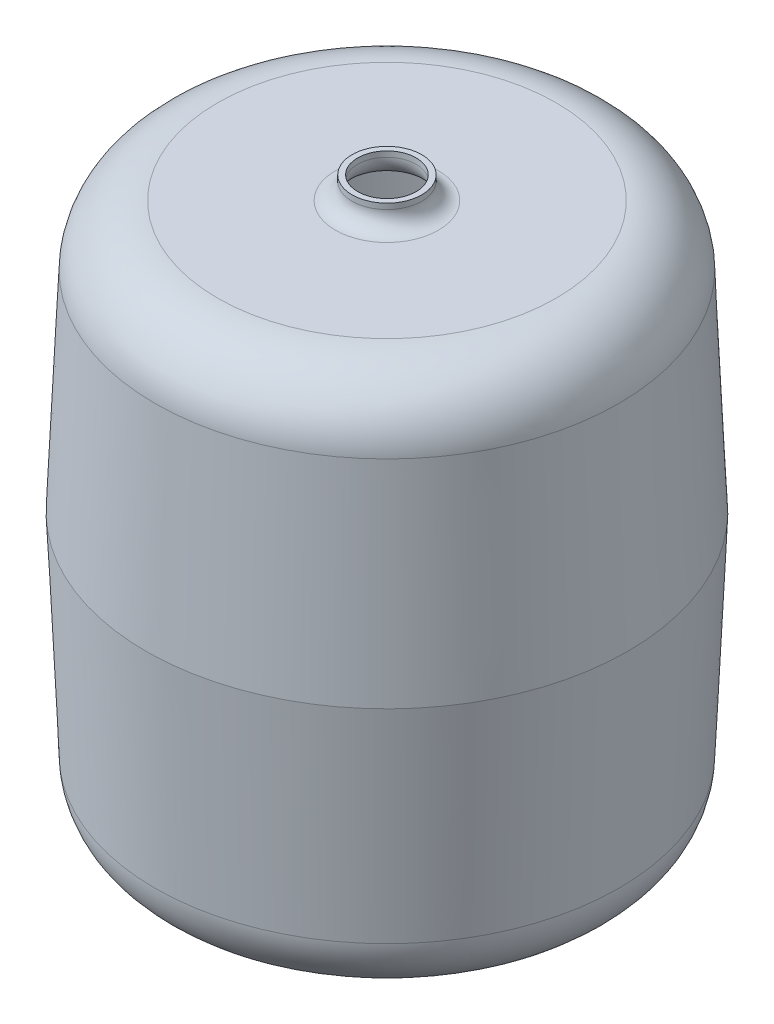
ISO-10303-21;
HEADER;
FILE_DESCRIPTION(('STEP AP214'),'2;1');
FILE_NAME('part.step','',(''),(''),'','','');
FILE_SCHEMA(('AUTOMOTIVE_DESIGN { 1 0 10303 214 1 1 1 1 }'));
ENDSEC;
DATA;
#1=APPLICATION_CONTEXT('core data for automotive mechanical design processes');
#2=APPLICATION_PROTOCOL_DEFINITION('international standard','automotive_design',2000,#1);
#3=PRODUCT_CONTEXT('',#1,'mechanical');
#4=PRODUCT('Part','Part','',(#3));
#5=PRODUCT_RELATED_PRODUCT_CATEGORY('part','',(#4));
#6=PRODUCT_DEFINITION_FORMATION('','',#4);
#7=PRODUCT_DEFINITION_CONTEXT('part definition',#1,'design');
#8=PRODUCT_DEFINITION('design','',#6,#7);
#9=PRODUCT_DEFINITION_SHAPE('','',#8);
#10=(LENGTH_UNIT() NAMED_UNIT(*) SI_UNIT(.MILLI.,.METRE.));
#11=(NAMED_UNIT(*) PLANE_ANGLE_UNIT() SI_UNIT($,.RADIAN.));
#12=(NAMED_UNIT(*) SI_UNIT($,.STERADIAN.) SOLID_ANGLE_UNIT());
#13=UNCERTAINTY_MEASURE_WITH_UNIT(LENGTH_MEASURE(1.E-05),#10,'distance_accuracy_value','');
#14=(GEOMETRIC_REPRESENTATION_CONTEXT(3) GLOBAL_UNCERTAINTY_ASSIGNED_CONTEXT((#13)) GLOBAL_UNIT_ASSIGNED_CONTEXT((#10,
#11,#12)) REPRESENTATION_CONTEXT('',''));
#15=CARTESIAN_POINT('',(0.,0.,0.));
#16=DIRECTION('',(0.,0.,1.));
#17=DIRECTION('',(1.,0.,0.));
#18=AXIS2_PLACEMENT_3D('',#15,#16,#17);
#19=CARTESIAN_POINT('',(0.,-193.75,0.));
#20=DIRECTION('',(0.,-1.,0.));
#21=DIRECTION('',(1.,0.,0.));
#22=AXIS2_PLACEMENT_3D('',#19,#20,#21);
#23=PLANE('',#22);
#24=CARTESIAN_POINT('',(0.,-193.75,0.));
#25=DIRECTION('',(0.,-1.,0.));
#26=DIRECTION('',(1.,0.,0.));
#27=AXIS2_PLACEMENT_3D('',#24,#25,#26);
#28=CIRCLE('',#27,121.539022915144);
#29=CARTESIAN_POINT('',(121.539022915144,-193.75,0.));
#30=VERTEX_POINT('',#29);
#31=EDGE_CURVE('E10',#30,#30,#28,.T.);
#32=ORIENTED_EDGE('',*,*,#31,.T.);
#33=EDGE_LOOP('',(#32));
#34=FACE_BOUND('',#33,.T.);
#35=ADVANCED_FACE('F34',(#34),#23,.T.);
#36=CARTESIAN_POINT('',(0.,-148.75,0.));
#37=DIRECTION('',(0.,-1.,0.));
#38=DIRECTION('',(1.,0.,0.));
#39=AXIS2_PLACEMENT_3D('',#36,#37,#38);
#40=TOROIDAL_SURFACE('',#39,121.539022915144,45.);
#41=CARTESIAN_POINT('',(0.,-150.71287243144,0.));
#42=DIRECTION('',(0.,-1.,0.));
#43=DIRECTION('',(1.,0.,0.));
#44=AXIS2_PLACEMENT_3D('',#41,#42,#43);
#45=CIRCLE('',#44,166.496192886328);
#46=CARTESIAN_POINT('',(166.496192886328,-150.71287243144,0.));
#47=VERTEX_POINT('',#46);
#48=EDGE_CURVE('E40',#47,#47,#45,.T.);
#49=ORIENTED_EDGE('',*,*,#48,.T.);
#50=EDGE_LOOP('',(#49));
#51=FACE_BOUND('',#50,.T.);
#52=ORIENTED_EDGE('',*,*,#31,.F.);
#53=EDGE_LOOP('',(#52));
#54=FACE_BOUND('',#53,.T.);
#55=ADVANCED_FACE('F102',(#51,#54),#40,.T.);
#56=CARTESIAN_POINT('',(0.,-150.71287243144,0.));
#57=DIRECTION('',(0.,1.,0.));
#58=DIRECTION('',(-1.,0.,0.));
#59=AXIS2_PLACEMENT_3D('',#56,#57,#58);
#60=CONICAL_SURFACE('',#59,166.496192886328,0.0436332312998528);
#61=CARTESIAN_POINT('',(0.,0.,0.));
#62=DIRECTION('',(0.,-1.,0.));
#63=DIRECTION('',(1.,0.,0.));
#64=AXIS2_PLACEMENT_3D('',#61,#62,#63);
#65=CIRCLE('',#64,173.076459005134);
#66=CARTESIAN_POINT('',(173.076459005134,0.,0.));
#67=VERTEX_POINT('',#66);
#68=EDGE_CURVE('E44',#67,#67,#65,.T.);
#69=ORIENTED_EDGE('',*,*,#68,.T.);
#70=EDGE_LOOP('',(#69));
#71=FACE_BOUND('',#70,.T.);
#72=ORIENTED_EDGE('',*,*,#48,.F.);
#73=EDGE_LOOP('',(#72));
#74=FACE_BOUND('',#73,.T.);
#75=ADVANCED_FACE('F106',(#71,#74),#60,.T.);
#76=CARTESIAN_POINT('',(0.,0.,0.));
#77=DIRECTION('',(0.,-1.,0.));
#78=DIRECTION('',(1.,0.,0.));
#79=AXIS2_PLACEMENT_3D('',#76,#77,#78);
#80=CONICAL_SURFACE('',#79,173.076459005134,0.0436332312998534);
#81=CARTESIAN_POINT('',(0.,150.71287243144,0.));
#82=DIRECTION('',(0.,-1.,0.));
#83=DIRECTION('',(1.,0.,0.));
#84=AXIS2_PLACEMENT_3D('',#81,#82,#83);
#85=CIRCLE('',#84,166.496192886327);
#86=CARTESIAN_POINT('',(166.496192886327,150.71287243144,0.));
#87=VERTEX_POINT('',#86);
#88=EDGE_CURVE('E48',#87,#87,#85,.T.);
#89=ORIENTED_EDGE('',*,*,#88,.T.);
#90=EDGE_LOOP('',(#89));
#91=FACE_BOUND('',#90,.T.);
#92=ORIENTED_EDGE('',*,*,#68,.F.);
#93=EDGE_LOOP('',(#92));
#94=FACE_BOUND('',#93,.T.);
#95=ADVANCED_FACE('F110',(#91,#94),#80,.T.);
#96=CARTESIAN_POINT('',(0.,148.75,0.));
#97=DIRECTION('',(0.,-1.,0.));
#98=DIRECTION('',(1.,0.,0.));
#99=AXIS2_PLACEMENT_3D('',#96,#97,#98);
#100=TOROIDAL_SURFACE('',#99,121.539022915144,45.0000000000002);
#101=CARTESIAN_POINT('',(0.,193.75,0.));
#102=DIRECTION('',(0.,-1.,0.));
#103=DIRECTION('',(1.,0.,0.));
#104=AXIS2_PLACEMENT_3D('',#101,#102,#103);
#105=CIRCLE('',#104,121.539022915144);
#106=CARTESIAN_POINT('',(121.539022915144,193.75,0.));
#107=VERTEX_POINT('',#106);
#108=EDGE_CURVE('E53',#107,#107,#105,.T.);
#109=ORIENTED_EDGE('',*,*,#108,.T.);
#110=EDGE_LOOP('',(#109));
#111=FACE_BOUND('',#110,.T.);
#112=ORIENTED_EDGE('',*,*,#88,.F.);
#113=EDGE_LOOP('',(#112));
#114=FACE_BOUND('',#113,.T.);
#115=ADVANCED_FACE('F117',(#111,#114),#100,.T.);
#116=CARTESIAN_POINT('',(121.539022915144,193.75,0.));
#117=DIRECTION('',(0.,1.,0.));
#118=DIRECTION('',(-1.,0.,0.));
#119=AXIS2_PLACEMENT_3D('',#116,#117,#118);
#120=PLANE('',#119);
#121=CARTESIAN_POINT('',(0.,193.75,0.));
#122=DIRECTION('',(0.,-1.,0.));
#123=DIRECTION('',(1.,0.,0.));
#124=AXIS2_PLACEMENT_3D('',#121,#122,#123);
#125=CIRCLE('',#124,37.);
#126=CARTESIAN_POINT('',(37.,193.75,0.));
#127=VERTEX_POINT('',#126);
#128=EDGE_CURVE('E56',#127,#127,#125,.T.);
#129=ORIENTED_EDGE('',*,*,#128,.T.);
#130=EDGE_LOOP('',(#129));
#131=FACE_BOUND('',#130,.T.);
#132=ORIENTED_EDGE('',*,*,#108,.F.);
#133=EDGE_LOOP('',(#132));
#134=FACE_BOUND('',#133,.T.);
#135=ADVANCED_FACE('F121',(#131,#134),#120,.T.);
#136=CARTESIAN_POINT('',(0.,205.75,0.));
#137=DIRECTION('',(0.,-1.,0.));
#138=DIRECTION('',(1.,0.,0.));
#139=AXIS2_PLACEMENT_3D('',#136,#137,#138);
#140=TOROIDAL_SURFACE('',#139,37.,12.);
#141=CARTESIAN_POINT('',(0.,205.75,0.));
#142=DIRECTION('',(0.,-1.,0.));
#143=DIRECTION('',(1.,0.,0.));
#144=AXIS2_PLACEMENT_3D('',#141,#142,#143);
#145=CIRCLE('',#144,25.);
#146=CARTESIAN_POINT('',(25.,205.75,0.));
#147=VERTEX_POINT('',#146);
#148=EDGE_CURVE('E59',#147,#147,#145,.T.);
#149=ORIENTED_EDGE('',*,*,#148,.T.);
#150=EDGE_LOOP('',(#149));
#151=FACE_BOUND('',#150,.T.);
#152=ORIENTED_EDGE('',*,*,#128,.F.);
#153=EDGE_LOOP('',(#152));
#154=FACE_BOUND('',#153,.T.);
#155=ADVANCED_FACE('F125',(#151,#154),#140,.F.);
#156=CARTESIAN_POINT('',(0.,-193.75,0.));
#157=DIRECTION('',(0.,-1.,0.));
#158=DIRECTION('',(1.,0.,0.));
#159=AXIS2_PLACEMENT_3D('',#156,#157,#158);
#160=CYLINDRICAL_SURFACE('',#159,25.);
#161=CARTESIAN_POINT('',(0.,209.75,0.));
#162=DIRECTION('',(0.,-1.,0.));
#163=DIRECTION('',(1.,0.,0.));
#164=AXIS2_PLACEMENT_3D('',#161,#162,#163);
#165=CIRCLE('',#164,25.);
#166=CARTESIAN_POINT('',(25.,209.75,0.));
#167=VERTEX_POINT('',#166);
#168=EDGE_CURVE('E62',#167,#167,#165,.T.);
#169=ORIENTED_EDGE('',*,*,#168,.T.);
#170=EDGE_LOOP('',(#169));
#171=FACE_BOUND('',#170,.T.);
#172=ORIENTED_EDGE('',*,*,#148,.F.);
#173=EDGE_LOOP('',(#172));
#174=FACE_BOUND('',#173,.T.);
#175=ADVANCED_FACE('F129',(#171,#174),#160,.T.);
#176=CARTESIAN_POINT('',(21.,209.75,0.));
#177=DIRECTION('',(0.,1.,0.));
#178=DIRECTION('',(-1.,0.,0.));
#179=AXIS2_PLACEMENT_3D('',#176,#177,#178);
#180=PLANE('',#179);
#181=CARTESIAN_POINT('',(0.,209.75,0.));
#182=DIRECTION('',(0.,-1.,0.));
#183=DIRECTION('',(1.,0.,0.));
#184=AXIS2_PLACEMENT_3D('',#181,#182,#183);
#185=CIRCLE('',#184,21.);
#186=CARTESIAN_POINT('',(21.,209.75,0.));
#187=VERTEX_POINT('',#186);
#188=EDGE_CURVE('E65',#187,#187,#185,.T.);
#189=ORIENTED_EDGE('',*,*,#188,.T.);
#190=EDGE_LOOP('',(#189));
#191=FACE_BOUND('',#190,.T.);
#192=ORIENTED_EDGE('',*,*,#168,.F.);
#193=EDGE_LOOP('',(#192));
#194=FACE_BOUND('',#193,.T.);
#195=ADVANCED_FACE('F133',(#191,#194),#180,.T.);
#196=CARTESIAN_POINT('',(0.,-193.75,0.));
#197=DIRECTION('',(0.,-1.,0.));
#198=DIRECTION('',(1.,0.,0.));
#199=AXIS2_PLACEMENT_3D('',#196,#197,#198);
#200=CYLINDRICAL_SURFACE('',#199,21.);
#201=CARTESIAN_POINT('',(0.,205.75,0.));
#202=DIRECTION('',(0.,-1.,0.));
#203=DIRECTION('',(1.,0.,0.));
#204=AXIS2_PLACEMENT_3D('',#201,#202,#203);
#205=CIRCLE('',#204,21.);
#206=CARTESIAN_POINT('',(21.,205.75,0.));
#207=VERTEX_POINT('',#206);
#208=EDGE_CURVE('E68',#207,#207,#205,.T.);
#209=ORIENTED_EDGE('',*,*,#208,.T.);
#210=EDGE_LOOP('',(#209));
#211=FACE_BOUND('',#210,.T.);
#212=ORIENTED_EDGE('',*,*,#188,.F.);
#213=EDGE_LOOP('',(#212));
#214=FACE_BOUND('',#213,.T.);
#215=ADVANCED_FACE('F137',(#211,#214),#200,.F.);
#216=CARTESIAN_POINT('',(0.,205.75,0.));
#217=DIRECTION('',(0.,-1.,0.));
#218=DIRECTION('',(1.,0.,0.));
#219=AXIS2_PLACEMENT_3D('',#216,#217,#218);
#220=TOROIDAL_SURFACE('',#219,37.,16.);
#221=CARTESIAN_POINT('',(0.,189.75,0.));
#222=DIRECTION('',(0.,-1.,0.));
#223=DIRECTION('',(1.,0.,0.));
#224=AXIS2_PLACEMENT_3D('',#221,#222,#223);
#225=CIRCLE('',#224,37.);
#226=CARTESIAN_POINT('',(37.,189.75,0.));
#227=VERTEX_POINT('',#226);
#228=EDGE_CURVE('E71',#227,#227,#225,.T.);
#229=ORIENTED_EDGE('',*,*,#228,.T.);
#230=EDGE_LOOP('',(#229));
#231=FACE_BOUND('',#230,.T.);
#232=ORIENTED_EDGE('',*,*,#208,.F.);
#233=EDGE_LOOP('',(#232));
#234=FACE_BOUND('',#233,.T.);
#235=ADVANCED_FACE('F141',(#231,#234),#220,.T.);
#236=CARTESIAN_POINT('',(121.539022915144,189.75,0.));
#237=DIRECTION('',(0.,-1.,0.));
#238=DIRECTION('',(1.,0.,0.));
#239=AXIS2_PLACEMENT_3D('',#236,#237,#238);
#240=PLANE('',#239);
#241=CARTESIAN_POINT('',(0.,189.75,0.));
#242=DIRECTION('',(0.,-1.,0.));
#243=DIRECTION('',(1.,0.,0.));
#244=AXIS2_PLACEMENT_3D('',#241,#242,#243);
#245=CIRCLE('',#244,121.539022915144);
#246=CARTESIAN_POINT('',(121.539022915144,189.75,0.));
#247=VERTEX_POINT('',#246);
#248=EDGE_CURVE('E74',#247,#247,#245,.T.);
#249=ORIENTED_EDGE('',*,*,#248,.T.);
#250=EDGE_LOOP('',(#249));
#251=FACE_BOUND('',#250,.T.);
#252=ORIENTED_EDGE('',*,*,#228,.F.);
#253=EDGE_LOOP('',(#252));
#254=FACE_BOUND('',#253,.T.);
#255=ADVANCED_FACE('F145',(#251,#254),#240,.T.);
#256=CARTESIAN_POINT('',(0.,148.75,0.));
#257=DIRECTION('',(0.,-1.,0.));
#258=DIRECTION('',(1.,0.,0.));
#259=AXIS2_PLACEMENT_3D('',#256,#257,#258);
#260=TOROIDAL_SURFACE('',#259,121.539022915144,41.0000000000001);
#261=CARTESIAN_POINT('',(0.,150.538394881978,0.));
#262=DIRECTION('',(0.,-1.,0.));
#263=DIRECTION('',(1.,0.,0.));
#264=AXIS2_PLACEMENT_3D('',#261,#262,#263);
#265=CIRCLE('',#264,162.5);
#266=CARTESIAN_POINT('',(162.5,150.538394881978,0.));
#267=VERTEX_POINT('',#266);
#268=EDGE_CURVE('E77',#267,#267,#265,.T.);
#269=ORIENTED_EDGE('',*,*,#268,.T.);
#270=EDGE_LOOP('',(#269));
#271=FACE_BOUND('',#270,.T.);
#272=ORIENTED_EDGE('',*,*,#248,.F.);
#273=EDGE_LOOP('',(#272));
#274=FACE_BOUND('',#273,.T.);
#275=ADVANCED_FACE('F149',(#271,#274),#260,.F.);
#276=CARTESIAN_POINT('',(0.,150.538394881978,0.));
#277=DIRECTION('',(0.,-1.,0.));
#278=DIRECTION('',(1.,0.,0.));
#279=AXIS2_PLACEMENT_3D('',#276,#277,#278);
#280=CONICAL_SURFACE('',#279,162.5,0.0436332312998529);
#281=CARTESIAN_POINT('',(0.,0.,0.));
#282=DIRECTION('',(0.,-1.,0.));
#283=DIRECTION('',(1.,0.,0.));
#284=AXIS2_PLACEMENT_3D('',#281,#282,#283);
#285=CIRCLE('',#284,169.07264826448);
#286=CARTESIAN_POINT('',(169.07264826448,0.,0.));
#287=VERTEX_POINT('',#286);
#288=EDGE_CURVE('E80',#287,#287,#285,.T.);
#289=ORIENTED_EDGE('',*,*,#288,.T.);
#290=EDGE_LOOP('',(#289));
#291=FACE_BOUND('',#290,.T.);
#292=ORIENTED_EDGE('',*,*,#268,.F.);
#293=EDGE_LOOP('',(#292));
#294=FACE_BOUND('',#293,.T.);
#295=ADVANCED_FACE('F153',(#291,#294),#280,.F.);
#296=CARTESIAN_POINT('',(0.,0.,0.));
#297=DIRECTION('',(0.,1.,0.));
#298=DIRECTION('',(-1.,0.,0.));
#299=AXIS2_PLACEMENT_3D('',#296,#297,#298);
#300=CONICAL_SURFACE('',#299,169.07264826448,0.0436332312998528);
#301=CARTESIAN_POINT('',(0.,-150.538394881979,0.));
#302=DIRECTION('',(0.,-1.,0.));
#303=DIRECTION('',(1.,0.,0.));
#304=AXIS2_PLACEMENT_3D('',#301,#302,#303);
#305=CIRCLE('',#304,162.5);
#306=CARTESIAN_POINT('',(162.5,-150.538394881979,0.));
#307=VERTEX_POINT('',#306);
#308=EDGE_CURVE('E83',#307,#307,#305,.T.);
#309=ORIENTED_EDGE('',*,*,#308,.T.);
#310=EDGE_LOOP('',(#309));
#311=FACE_BOUND('',#310,.T.);
#312=ORIENTED_EDGE('',*,*,#288,.F.);
#313=EDGE_LOOP('',(#312));
#314=FACE_BOUND('',#313,.T.);
#315=ADVANCED_FACE('F99',(#311,#314),#300,.F.);
#316=CARTESIAN_POINT('',(0.,-148.75,0.));
#317=DIRECTION('',(0.,-1.,0.));
#318=DIRECTION('',(1.,0.,0.));
#319=AXIS2_PLACEMENT_3D('',#316,#317,#318);
#320=TOROIDAL_SURFACE('',#319,121.539022915144,41.);
#321=CARTESIAN_POINT('',(0.,-189.75,0.));
#322=DIRECTION('',(0.,-1.,0.));
#323=DIRECTION('',(1.,0.,0.));
#324=AXIS2_PLACEMENT_3D('',#321,#322,#323);
#325=CIRCLE('',#324,121.539022915144);
#326=CARTESIAN_POINT('',(121.539022915144,-189.75,0.));
#327=VERTEX_POINT('',#326);
#328=EDGE_CURVE('E86',#327,#327,#325,.T.);
#329=ORIENTED_EDGE('',*,*,#328,.T.);
#330=EDGE_LOOP('',(#329));
#331=FACE_BOUND('',#330,.T.);
#332=ORIENTED_EDGE('',*,*,#308,.F.);
#333=EDGE_LOOP('',(#332));
#334=FACE_BOUND('',#333,.T.);
#335=ADVANCED_FACE('F90',(#331,#334),#320,.F.);
#336=CARTESIAN_POINT('',(0.,-189.75,0.));
#337=DIRECTION('',(0.,1.,0.));
#338=DIRECTION('',(-1.,0.,0.));
#339=AXIS2_PLACEMENT_3D('',#336,#337,#338);
#340=PLANE('',#339);
#341=ORIENTED_EDGE('',*,*,#328,.F.);
#342=EDGE_LOOP('',(#341));
#343=FACE_BOUND('',#342,.T.);
#344=ADVANCED_FACE('F93',(#343),#340,.T.);
#345=CLOSED_SHELL('',(#35,#55,#75,#95,#115,#135,#155,#175,#195,#215,#235,#255,#275,#295,#315,
#335,#344));
#346=MANIFOLD_SOLID_BREP('B2',#345);
#347=ADVANCED_BREP_SHAPE_REPRESENTATION('',(#18,#346),#14);
#348=SHAPE_DEFINITION_REPRESENTATION(#9,#347);
ENDSEC;
END-ISO-10303-21;
